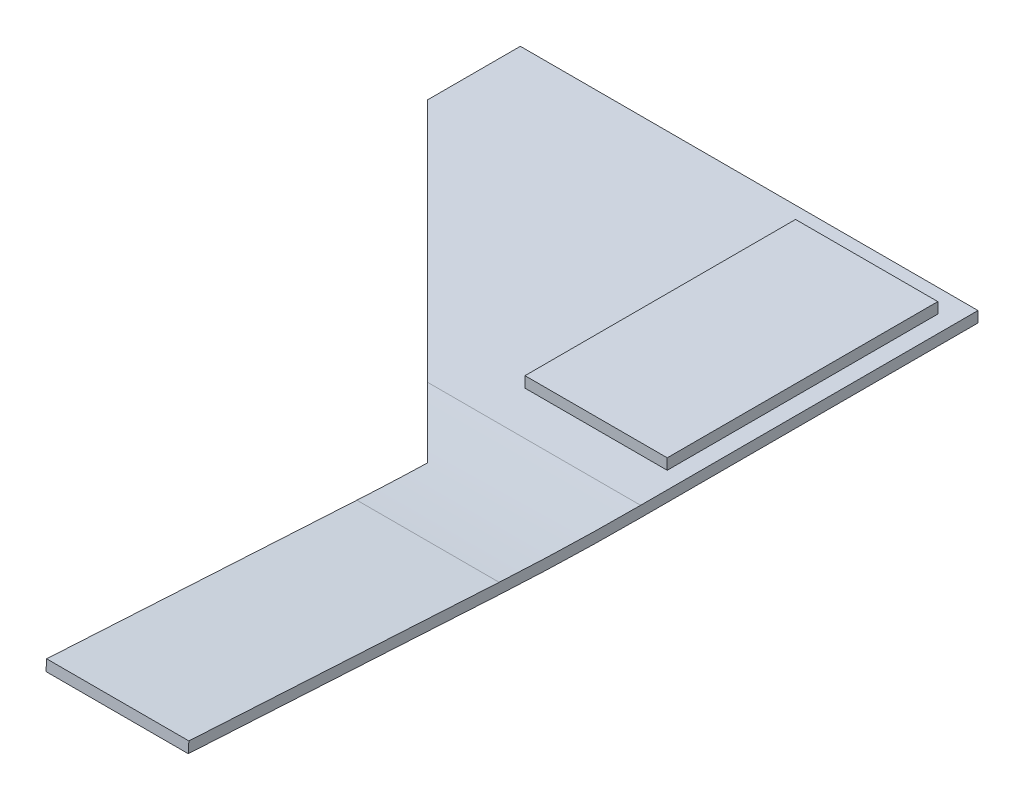
ISO-10303-21;
HEADER;
FILE_DESCRIPTION(('STEP AP214'),'2;1');
FILE_NAME('part.step','',(''),(''),'','','');
FILE_SCHEMA(('AUTOMOTIVE_DESIGN { 1 0 10303 214 1 1 1 1 }'));
ENDSEC;
DATA;
#1=APPLICATION_CONTEXT('core data for automotive mechanical design processes');
#2=APPLICATION_PROTOCOL_DEFINITION('international standard','automotive_design',2000,#1);
#3=PRODUCT_CONTEXT('',#1,'mechanical');
#4=PRODUCT('Part','Part','',(#3));
#5=PRODUCT_RELATED_PRODUCT_CATEGORY('part','',(#4));
#6=PRODUCT_DEFINITION_FORMATION('','',#4);
#7=PRODUCT_DEFINITION_CONTEXT('part definition',#1,'design');
#8=PRODUCT_DEFINITION('design','',#6,#7);
#9=PRODUCT_DEFINITION_SHAPE('','',#8);
#10=(LENGTH_UNIT() NAMED_UNIT(*) SI_UNIT(.MILLI.,.METRE.));
#11=(NAMED_UNIT(*) PLANE_ANGLE_UNIT() SI_UNIT($,.RADIAN.));
#12=(NAMED_UNIT(*) SI_UNIT($,.STERADIAN.) SOLID_ANGLE_UNIT());
#13=UNCERTAINTY_MEASURE_WITH_UNIT(LENGTH_MEASURE(1.E-05),#10,'distance_accuracy_value','');
#14=(GEOMETRIC_REPRESENTATION_CONTEXT(3) GLOBAL_UNCERTAINTY_ASSIGNED_CONTEXT((#13)) GLOBAL_UNIT_ASSIGNED_CONTEXT((#10,
#11,#12)) REPRESENTATION_CONTEXT('',''));
#15=CARTESIAN_POINT('',(0.,0.,0.));
#16=DIRECTION('',(0.,0.,1.));
#17=DIRECTION('',(1.,0.,0.));
#18=AXIS2_PLACEMENT_3D('',#15,#16,#17);
#19=CARTESIAN_POINT('',(-2.79400000000007,256.9464,37.3644658453137));
#20=DIRECTION('',(-1.,0.,0.));
#21=DIRECTION('',(0.,0.,1.));
#22=AXIS2_PLACEMENT_3D('',#19,#20,#21);
#23=CYLINDRICAL_SURFACE('',#22,203.2);
#24=CARTESIAN_POINT('',(-20.2935341546864,256.9464,37.3644658453137));
#25=DIRECTION('',(0.707106781186547,0.,-0.707106781186548));
#26=DIRECTION('',(-0.707106781186548,0.,-0.707106781186547));
#27=AXIS2_PLACEMENT_3D('',#24,#25,#26);
#28=ELLIPSE('',#27,287.368195874213,203.2);
#29=CARTESIAN_POINT('',(-20.2935341546864,53.7464,37.3644658453137));
#30=VERTEX_POINT('',#29);
#31=CARTESIAN_POINT('',(-14.478,53.8296366285449,43.18));
#32=VERTEX_POINT('',#31);
#33=EDGE_CURVE('E68',#30,#32,#28,.F.);
#34=ORIENTED_EDGE('',*,*,#33,.F.);
#35=DIRECTION('',(-1.,0.,0.));
#36=VECTOR('',#35,1.);
#37=CARTESIAN_POINT('',(-2.79400000000004,53.7464,37.3644658453137));
#38=LINE('',#37,#36);
#39=CARTESIAN_POINT('',(-2.79400000000004,53.7464,37.3644658453137));
#40=VERTEX_POINT('',#39);
#41=EDGE_CURVE('E49',#40,#30,#38,.T.);
#42=ORIENTED_EDGE('',*,*,#41,.F.);
#43=CARTESIAN_POINT('',(-2.79400000000007,256.9464,37.3644658453137));
#44=DIRECTION('',(-1.,0.,0.));
#45=DIRECTION('',(0.,0.,1.));
#46=AXIS2_PLACEMENT_3D('',#43,#44,#45);
#47=CIRCLE('',#46,203.2);
#48=CARTESIAN_POINT('',(-2.79400000000004,54.0790058876171,48.9860150557718));
#49=VERTEX_POINT('',#48);
#50=EDGE_CURVE('E234',#49,#40,#47,.F.);
#51=ORIENTED_EDGE('',*,*,#50,.F.);
#52=DIRECTION('',(-1.,0.,0.));
#53=VECTOR('',#52,1.);
#54=CARTESIAN_POINT('',(-2.79400000000003,54.0790058876171,48.9860150557718));
#55=LINE('',#54,#53);
#56=CARTESIAN_POINT('',(-14.478,54.0790058876171,48.9860150557718));
#57=VERTEX_POINT('',#56);
#58=EDGE_CURVE('E12',#49,#57,#55,.T.);
#59=ORIENTED_EDGE('',*,*,#58,.T.);
#60=CARTESIAN_POINT('',(-14.4780000000001,256.9464,37.3644658453137));
#61=DIRECTION('',(1.,0.,0.));
#62=DIRECTION('',(0.,1.,0.));
#63=AXIS2_PLACEMENT_3D('',#60,#61,#62);
#64=CIRCLE('',#63,203.2);
#65=EDGE_CURVE('E232',#32,#57,#64,.F.);
#66=ORIENTED_EDGE('',*,*,#65,.F.);
#67=EDGE_LOOP('',(#34,#42,#51,#59,#66));
#68=FACE_BOUND('',#67,.T.);
#69=ADVANCED_FACE('F45',(#68),#23,.T.);
#70=CARTESIAN_POINT('',(-2.79400000000003,55.5419318853809,74.5230565956833));
#71=DIRECTION('',(0.,0.998363160001885,-0.0571926634372937));
#72=DIRECTION('',(0.,0.0571926634372937,0.998363160001885));
#73=AXIS2_PLACEMENT_3D('',#70,#71,#72);
#74=PLANE('',#73);
#75=ORIENTED_EDGE('',*,*,#58,.F.);
#76=DIRECTION('',(0.,-0.0571926634372938,-0.998363160001885));
#77=VECTOR('',#76,1.);
#78=CARTESIAN_POINT('',(-2.79400000000003,55.5419318853809,74.5230565956833));
#79=LINE('',#78,#77);
#80=CARTESIAN_POINT('',(-2.79400000000003,55.5419318853809,74.5230565956833));
#81=VERTEX_POINT('',#80);
#82=EDGE_CURVE('E184',#81,#49,#79,.T.);
#83=ORIENTED_EDGE('',*,*,#82,.F.);
#84=DIRECTION('',(1.,0.,0.));
#85=VECTOR('',#84,1.);
#86=CARTESIAN_POINT('',(-14.478,55.5419318853809,74.5230565956833));
#87=LINE('',#86,#85);
#88=CARTESIAN_POINT('',(-14.478,55.5419318853809,74.5230565956833));
#89=VERTEX_POINT('',#88);
#90=EDGE_CURVE('E195',#89,#81,#87,.T.);
#91=ORIENTED_EDGE('',*,*,#90,.F.);
#92=DIRECTION('',(0.,-0.0571926634372938,-0.998363160001885));
#93=VECTOR('',#92,1.);
#94=CARTESIAN_POINT('',(-14.478,55.5419318853809,74.5230565956833));
#95=LINE('',#94,#93);
#96=EDGE_CURVE('E60',#89,#57,#95,.T.);
#97=ORIENTED_EDGE('',*,*,#96,.T.);
#98=EDGE_LOOP('',(#75,#83,#91,#97));
#99=FACE_BOUND('',#98,.T.);
#100=ADVANCED_FACE('F47',(#99),#74,.F.);
#101=CARTESIAN_POINT('',(0.,55.5244,0.));
#102=DIRECTION('',(0.,-1.,0.));
#103=DIRECTION('',(1.,0.,0.));
#104=AXIS2_PLACEMENT_3D('',#101,#102,#103);
#105=PLANE('',#104);
#106=DIRECTION('',(0.,0.,1.));
#107=VECTOR('',#106,1.);
#108=CARTESIAN_POINT('',(-15.875,55.5244,33.7820000000001));
#109=LINE('',#108,#107);
#110=CARTESIAN_POINT('',(-15.875,55.5244,11.5570000000001));
#111=VERTEX_POINT('',#110);
#112=CARTESIAN_POINT('',(-15.875,55.5244,33.7820000000001));
#113=VERTEX_POINT('',#112);
#114=EDGE_CURVE('E160',#111,#113,#109,.T.);
#115=ORIENTED_EDGE('',*,*,#114,.T.);
#116=DIRECTION('',(1.,0.,0.));
#117=VECTOR('',#116,1.);
#118=CARTESIAN_POINT('',(-15.875,55.5244,33.7820000000001));
#119=LINE('',#118,#117);
#120=CARTESIAN_POINT('',(-4.19100000000002,55.5244,33.7820000000001));
#121=VERTEX_POINT('',#120);
#122=EDGE_CURVE('E148',#113,#121,#119,.T.);
#123=ORIENTED_EDGE('',*,*,#122,.T.);
#124=DIRECTION('',(0.,0.,-1.));
#125=VECTOR('',#124,1.);
#126=CARTESIAN_POINT('',(-4.19100000000002,55.5244,33.7820000000001));
#127=LINE('',#126,#125);
#128=CARTESIAN_POINT('',(-4.19100000000002,55.5244,11.5570000000001));
#129=VERTEX_POINT('',#128);
#130=EDGE_CURVE('E159',#121,#129,#127,.T.);
#131=ORIENTED_EDGE('',*,*,#130,.T.);
#132=DIRECTION('',(-1.,0.,0.));
#133=VECTOR('',#132,1.);
#134=CARTESIAN_POINT('',(-15.875,55.5244,11.5570000000001));
#135=LINE('',#134,#133);
#136=EDGE_CURVE('E165',#129,#111,#135,.T.);
#137=ORIENTED_EDGE('',*,*,#136,.T.);
#138=EDGE_LOOP('',(#115,#123,#131,#137));
#139=FACE_BOUND('',#138,.T.);
#140=ADVANCED_FACE('F163',(#139),#105,.F.);
#141=CARTESIAN_POINT('',(-15.875,55.5244,33.7820000000001));
#142=DIRECTION('',(0.,0.,-1.));
#143=DIRECTION('',(-1.,0.,0.));
#144=AXIS2_PLACEMENT_3D('',#141,#142,#143);
#145=PLANE('',#144);
#146=DIRECTION('',(1.,0.,0.));
#147=VECTOR('',#146,1.);
#148=CARTESIAN_POINT('',(-15.875,54.6354,33.7820000000001));
#149=LINE('',#148,#147);
#150=CARTESIAN_POINT('',(-15.875,54.6354,33.7820000000001));
#151=VERTEX_POINT('',#150);
#152=CARTESIAN_POINT('',(-4.19100000000002,54.6354,33.7820000000001));
#153=VERTEX_POINT('',#152);
#154=EDGE_CURVE('E448',#151,#153,#149,.T.);
#155=ORIENTED_EDGE('',*,*,#154,.T.);
#156=DIRECTION('',(0.,-1.,0.));
#157=VECTOR('',#156,1.);
#158=CARTESIAN_POINT('',(-4.19100000000002,55.5244,33.7820000000001));
#159=LINE('',#158,#157);
#160=EDGE_CURVE('E156',#121,#153,#159,.T.);
#161=ORIENTED_EDGE('',*,*,#160,.F.);
#162=ORIENTED_EDGE('',*,*,#122,.F.);
#163=DIRECTION('',(0.,-1.,0.));
#164=VECTOR('',#163,1.);
#165=CARTESIAN_POINT('',(-15.875,55.5244,33.7820000000001));
#166=LINE('',#165,#164);
#167=EDGE_CURVE('E153',#113,#151,#166,.T.);
#168=ORIENTED_EDGE('',*,*,#167,.T.);
#169=EDGE_LOOP('',(#155,#161,#162,#168));
#170=FACE_BOUND('',#169,.T.);
#171=ADVANCED_FACE('F151',(#170),#145,.F.);
#172=CARTESIAN_POINT('',(-4.19100000000002,55.5244,33.7820000000001));
#173=DIRECTION('',(-1.,0.,0.));
#174=DIRECTION('',(0.,-1.,0.));
#175=AXIS2_PLACEMENT_3D('',#172,#173,#174);
#176=PLANE('',#175);
#177=DIRECTION('',(0.,0.,-1.));
#178=VECTOR('',#177,1.);
#179=CARTESIAN_POINT('',(-4.19100000000002,54.6354,33.7820000000001));
#180=LINE('',#179,#178);
#181=CARTESIAN_POINT('',(-4.19100000000002,54.6354,11.5570000000001));
#182=VERTEX_POINT('',#181);
#183=EDGE_CURVE('E442',#153,#182,#180,.T.);
#184=ORIENTED_EDGE('',*,*,#183,.T.);
#185=DIRECTION('',(0.,-1.,0.));
#186=VECTOR('',#185,1.);
#187=CARTESIAN_POINT('',(-4.19100000000002,55.5244,11.5570000000001));
#188=LINE('',#187,#186);
#189=EDGE_CURVE('E177',#129,#182,#188,.T.);
#190=ORIENTED_EDGE('',*,*,#189,.F.);
#191=ORIENTED_EDGE('',*,*,#130,.F.);
#192=ORIENTED_EDGE('',*,*,#160,.T.);
#193=EDGE_LOOP('',(#184,#190,#191,#192));
#194=FACE_BOUND('',#193,.T.);
#195=ADVANCED_FACE('F405',(#194),#176,.F.);
#196=CARTESIAN_POINT('',(-15.875,55.5244,11.5570000000001));
#197=DIRECTION('',(0.,0.,1.));
#198=DIRECTION('',(1.,0.,0.));
#199=AXIS2_PLACEMENT_3D('',#196,#197,#198);
#200=PLANE('',#199);
#201=DIRECTION('',(-1.,0.,0.));
#202=VECTOR('',#201,1.);
#203=CARTESIAN_POINT('',(-15.875,54.6354,11.5570000000001));
#204=LINE('',#203,#202);
#205=CARTESIAN_POINT('',(-15.875,54.6354,11.5570000000001));
#206=VERTEX_POINT('',#205);
#207=EDGE_CURVE('E169',#182,#206,#204,.T.);
#208=ORIENTED_EDGE('',*,*,#207,.T.);
#209=DIRECTION('',(0.,-1.,0.));
#210=VECTOR('',#209,1.);
#211=CARTESIAN_POINT('',(-15.875,55.5244,11.5570000000001));
#212=LINE('',#211,#210);
#213=EDGE_CURVE('E439',#111,#206,#212,.T.);
#214=ORIENTED_EDGE('',*,*,#213,.F.);
#215=ORIENTED_EDGE('',*,*,#136,.F.);
#216=ORIENTED_EDGE('',*,*,#189,.T.);
#217=EDGE_LOOP('',(#208,#214,#215,#216));
#218=FACE_BOUND('',#217,.T.);
#219=ADVANCED_FACE('F398',(#218),#200,.F.);
#220=CARTESIAN_POINT('',(-15.875,55.5244,33.7820000000001));
#221=DIRECTION('',(1.,0.,0.));
#222=DIRECTION('',(0.,1.,0.));
#223=AXIS2_PLACEMENT_3D('',#220,#221,#222);
#224=PLANE('',#223);
#225=DIRECTION('',(0.,0.,1.));
#226=VECTOR('',#225,1.);
#227=CARTESIAN_POINT('',(-15.875,54.6354,33.7820000000001));
#228=LINE('',#227,#226);
#229=EDGE_CURVE('E172',#206,#151,#228,.T.);
#230=ORIENTED_EDGE('',*,*,#229,.T.);
#231=ORIENTED_EDGE('',*,*,#167,.F.);
#232=ORIENTED_EDGE('',*,*,#114,.F.);
#233=ORIENTED_EDGE('',*,*,#213,.T.);
#234=EDGE_LOOP('',(#230,#231,#232,#233));
#235=FACE_BOUND('',#234,.T.);
#236=ADVANCED_FACE('F171',(#235),#224,.F.);
#237=CARTESIAN_POINT('',(-40.386,54.6354,17.2720000000001));
#238=DIRECTION('',(1.,0.,0.));
#239=DIRECTION('',(0.,0.,-1.));
#240=AXIS2_PLACEMENT_3D('',#237,#238,#239);
#241=PLANE('',#240);
#242=DIRECTION('',(0.,0.,1.));
#243=VECTOR('',#242,1.);
#244=CARTESIAN_POINT('',(-40.386,53.7464,17.2720000000001));
#245=LINE('',#244,#243);
#246=CARTESIAN_POINT('',(-40.386,53.7464,9.65200000000007));
#247=VERTEX_POINT('',#246);
#248=CARTESIAN_POINT('',(-40.386,53.7464,17.2720000000001));
#249=VERTEX_POINT('',#248);
#250=EDGE_CURVE('E205',#247,#249,#245,.T.);
#251=ORIENTED_EDGE('',*,*,#250,.T.);
#252=DIRECTION('',(0.,-1.,0.));
#253=VECTOR('',#252,1.);
#254=CARTESIAN_POINT('',(-40.386,54.6354,17.2720000000001));
#255=LINE('',#254,#253);
#256=CARTESIAN_POINT('',(-40.386,54.6354,17.2720000000001));
#257=VERTEX_POINT('',#256);
#258=EDGE_CURVE('E211',#257,#249,#255,.T.);
#259=ORIENTED_EDGE('',*,*,#258,.F.);
#260=DIRECTION('',(0.,0.,1.));
#261=VECTOR('',#260,1.);
#262=CARTESIAN_POINT('',(-40.386,54.6354,17.2720000000001));
#263=LINE('',#262,#261);
#264=CARTESIAN_POINT('',(-40.386,54.6354,9.65200000000007));
#265=VERTEX_POINT('',#264);
#266=EDGE_CURVE('E209',#265,#257,#263,.T.);
#267=ORIENTED_EDGE('',*,*,#266,.F.);
#268=DIRECTION('',(0.,-1.,0.));
#269=VECTOR('',#268,1.);
#270=CARTESIAN_POINT('',(-40.386,54.6354,9.65200000000007));
#271=LINE('',#270,#269);
#272=EDGE_CURVE('E222',#265,#247,#271,.T.);
#273=ORIENTED_EDGE('',*,*,#272,.T.);
#274=EDGE_LOOP('',(#251,#259,#267,#273));
#275=FACE_BOUND('',#274,.T.);
#276=ADVANCED_FACE('F288',(#275),#241,.F.);
#277=CARTESIAN_POINT('',(-14.478,56.4280239657132,74.4722955418351));
#278=DIRECTION('',(0.,0.0571926634372976,0.998363160001884));
#279=DIRECTION('',(0.,-0.998363160001884,0.0571926634372976));
#280=AXIS2_PLACEMENT_3D('',#277,#278,#279);
#281=PLANE('',#280);
#282=DIRECTION('',(0.,-0.998363160001884,0.0571926634372976));
#283=VECTOR('',#282,1.);
#284=CARTESIAN_POINT('',(-2.79400000000003,56.4280239657132,74.4722955418351));
#285=LINE('',#284,#283);
#286=CARTESIAN_POINT('',(-2.79400000000003,56.4280239657132,74.4722955418351));
#287=VERTEX_POINT('',#286);
#288=EDGE_CURVE('E175',#287,#81,#285,.T.);
#289=ORIENTED_EDGE('',*,*,#288,.F.);
#290=DIRECTION('',(1.,0.,0.));
#291=VECTOR('',#290,1.);
#292=CARTESIAN_POINT('',(-14.478,56.4280239657132,74.4722955418351));
#293=LINE('',#292,#291);
#294=CARTESIAN_POINT('',(-14.478,56.4280239657132,74.4722955418351));
#295=VERTEX_POINT('',#294);
#296=EDGE_CURVE('E187',#295,#287,#293,.T.);
#297=ORIENTED_EDGE('',*,*,#296,.F.);
#298=DIRECTION('',(0.,-0.998363160001884,0.0571926634372976));
#299=VECTOR('',#298,1.);
#300=CARTESIAN_POINT('',(-14.478,56.4280239657132,74.4722955418351));
#301=LINE('',#300,#299);
#302=EDGE_CURVE('E183',#295,#89,#301,.T.);
#303=ORIENTED_EDGE('',*,*,#302,.T.);
#304=ORIENTED_EDGE('',*,*,#90,.T.);
#305=EDGE_LOOP('',(#289,#297,#303,#304));
#306=FACE_BOUND('',#305,.T.);
#307=ADVANCED_FACE('F273',(#306),#281,.T.);
#308=CARTESIAN_POINT('',(-14.478,54.6354,43.18));
#309=DIRECTION('',(0.,0.998363160001884,-0.0571926634372938));
#310=DIRECTION('',(0.,0.0571926634372938,0.998363160001885));
#311=AXIS2_PLACEMENT_3D('',#308,#309,#310);
#312=PLANE('',#311);
#313=DIRECTION('',(0.,0.0571926634372938,0.998363160001885));
#314=VECTOR('',#313,1.);
#315=CARTESIAN_POINT('',(-2.79400000000004,54.6354,43.18));
#316=LINE('',#315,#314);
#317=CARTESIAN_POINT('',(-2.79400000000004,54.9680058876171,48.9860150557718));
#318=VERTEX_POINT('',#317);
#319=EDGE_CURVE('E173',#318,#287,#316,.T.);
#320=ORIENTED_EDGE('',*,*,#319,.F.);
#321=DIRECTION('',(1.,0.,0.));
#322=VECTOR('',#321,1.);
#323=CARTESIAN_POINT('',(-14.478,54.9680058876171,48.9860150557718));
#324=LINE('',#323,#322);
#325=CARTESIAN_POINT('',(-14.478,54.9680058876171,48.9860150557718));
#326=VERTEX_POINT('',#325);
#327=EDGE_CURVE('E241',#318,#326,#324,.F.);
#328=ORIENTED_EDGE('',*,*,#327,.T.);
#329=DIRECTION('',(0.,0.0571926634372938,0.998363160001885));
#330=VECTOR('',#329,1.);
#331=CARTESIAN_POINT('',(-14.478,54.6354,43.18));
#332=LINE('',#331,#330);
#333=EDGE_CURVE('E181',#326,#295,#332,.T.);
#334=ORIENTED_EDGE('',*,*,#333,.T.);
#335=ORIENTED_EDGE('',*,*,#296,.T.);
#336=EDGE_LOOP('',(#320,#328,#334,#335));
#337=FACE_BOUND('',#336,.T.);
#338=ADVANCED_FACE('F268',(#337),#312,.T.);
#339=CARTESIAN_POINT('',(-1.34894638775802E-13,257.8354,37.3644658453137));
#340=DIRECTION('',(1.,0.,0.));
#341=DIRECTION('',(0.,0.,-1.));
#342=AXIS2_PLACEMENT_3D('',#339,#340,#341);
#343=CYLINDRICAL_SURFACE('',#342,203.2);
#344=CARTESIAN_POINT('',(-14.4780000000001,257.8354,37.3644658453137));
#345=DIRECTION('',(1.,0.,0.));
#346=DIRECTION('',(0.,1.,0.));
#347=AXIS2_PLACEMENT_3D('',#344,#345,#346);
#348=CIRCLE('',#347,203.2);
#349=CARTESIAN_POINT('',(-14.478,54.7186366285449,43.18));
#350=VERTEX_POINT('',#349);
#351=EDGE_CURVE('E245',#326,#350,#348,.T.);
#352=ORIENTED_EDGE('',*,*,#351,.F.);
#353=ORIENTED_EDGE('',*,*,#327,.F.);
#354=CARTESIAN_POINT('',(-2.79400000000007,257.8354,37.3644658453137));
#355=DIRECTION('',(-1.,0.,0.));
#356=DIRECTION('',(0.,0.,1.));
#357=AXIS2_PLACEMENT_3D('',#354,#355,#356);
#358=CIRCLE('',#357,203.2);
#359=CARTESIAN_POINT('',(-2.79400000000004,54.6354,37.3644658453137));
#360=VERTEX_POINT('',#359);
#361=EDGE_CURVE('E243',#360,#318,#358,.T.);
#362=ORIENTED_EDGE('',*,*,#361,.F.);
#363=DIRECTION('',(1.,0.,0.));
#364=VECTOR('',#363,1.);
#365=CARTESIAN_POINT('',(0.,54.6354,37.3644658453137));
#366=LINE('',#365,#364);
#367=CARTESIAN_POINT('',(-20.2935341546864,54.6354,37.3644658453137));
#368=VERTEX_POINT('',#367);
#369=EDGE_CURVE('E238',#368,#360,#366,.T.);
#370=ORIENTED_EDGE('',*,*,#369,.F.);
#371=CARTESIAN_POINT('',(-20.2935341546865,257.8354,37.3644658453137));
#372=DIRECTION('',(0.707106781186547,0.,-0.707106781186548));
#373=DIRECTION('',(0.707106781186548,0.,0.707106781186547));
#374=AXIS2_PLACEMENT_3D('',#371,#372,#373);
#375=ELLIPSE('',#374,287.368195874213,203.2);
#376=EDGE_CURVE('E188',#350,#368,#375,.T.);
#377=ORIENTED_EDGE('',*,*,#376,.F.);
#378=EDGE_LOOP('',(#352,#353,#362,#370,#377));
#379=FACE_BOUND('',#378,.T.);
#380=ADVANCED_FACE('F261',(#379),#343,.F.);
#381=CARTESIAN_POINT('',(0.,54.6354,0.));
#382=DIRECTION('',(0.,-1.,0.));
#383=DIRECTION('',(1.,0.,0.));
#384=AXIS2_PLACEMENT_3D('',#381,#382,#383);
#385=PLANE('',#384);
#386=DIRECTION('',(0.707106781186548,0.,0.707106781186547));
#387=VECTOR('',#386,1.);
#388=CARTESIAN_POINT('',(-14.478,54.6354,43.18));
#389=LINE('',#388,#387);
#390=EDGE_CURVE('E201',#257,#368,#389,.T.);
#391=ORIENTED_EDGE('',*,*,#390,.T.);
#392=ORIENTED_EDGE('',*,*,#369,.T.);
#393=DIRECTION('',(0.,0.,-1.));
#394=VECTOR('',#393,1.);
#395=CARTESIAN_POINT('',(-2.79400000000004,54.6354,9.65200000000007));
#396=LINE('',#395,#394);
#397=CARTESIAN_POINT('',(-2.79400000000004,54.6354,9.65200000000007));
#398=VERTEX_POINT('',#397);
#399=EDGE_CURVE('E204',#360,#398,#396,.T.);
#400=ORIENTED_EDGE('',*,*,#399,.T.);
#401=DIRECTION('',(-1.,0.,0.));
#402=VECTOR('',#401,1.);
#403=CARTESIAN_POINT('',(-40.386,54.6354,9.65200000000007));
#404=LINE('',#403,#402);
#405=EDGE_CURVE('E207',#398,#265,#404,.T.);
#406=ORIENTED_EDGE('',*,*,#405,.T.);
#407=ORIENTED_EDGE('',*,*,#266,.T.);
#408=EDGE_LOOP('',(#391,#392,#400,#406,#407));
#409=FACE_BOUND('',#408,.T.);
#410=ORIENTED_EDGE('',*,*,#229,.F.);
#411=ORIENTED_EDGE('',*,*,#207,.F.);
#412=ORIENTED_EDGE('',*,*,#183,.F.);
#413=ORIENTED_EDGE('',*,*,#154,.F.);
#414=EDGE_LOOP('',(#410,#411,#412,#413));
#415=FACE_BOUND('',#414,.T.);
#416=ADVANCED_FACE('F256',(#409,#415),#385,.F.);
#417=CARTESIAN_POINT('',(-40.386,54.6354,9.65200000000007));
#418=DIRECTION('',(0.,0.,1.));
#419=DIRECTION('',(1.,0.,0.));
#420=AXIS2_PLACEMENT_3D('',#417,#418,#419);
#421=PLANE('',#420);
#422=DIRECTION('',(-1.,0.,0.));
#423=VECTOR('',#422,1.);
#424=CARTESIAN_POINT('',(-40.386,53.7464,9.65200000000007));
#425=LINE('',#424,#423);
#426=CARTESIAN_POINT('',(-2.79400000000004,53.7464,9.65200000000007));
#427=VERTEX_POINT('',#426);
#428=EDGE_CURVE('E216',#427,#247,#425,.T.);
#429=ORIENTED_EDGE('',*,*,#428,.T.);
#430=ORIENTED_EDGE('',*,*,#272,.F.);
#431=ORIENTED_EDGE('',*,*,#405,.F.);
#432=DIRECTION('',(0.,-1.,0.));
#433=VECTOR('',#432,1.);
#434=CARTESIAN_POINT('',(-2.79400000000004,54.6354,9.65200000000007));
#435=LINE('',#434,#433);
#436=EDGE_CURVE('E225',#398,#427,#435,.T.);
#437=ORIENTED_EDGE('',*,*,#436,.T.);
#438=EDGE_LOOP('',(#429,#430,#431,#437));
#439=FACE_BOUND('',#438,.T.);
#440=ADVANCED_FACE('F285',(#439),#421,.F.);
#441=CARTESIAN_POINT('',(0.,53.7464,0.));
#442=DIRECTION('',(0.,-1.,0.));
#443=DIRECTION('',(1.,0.,0.));
#444=AXIS2_PLACEMENT_3D('',#441,#442,#443);
#445=PLANE('',#444);
#446=DIRECTION('',(0.,0.,-1.));
#447=VECTOR('',#446,1.);
#448=CARTESIAN_POINT('',(-2.79400000000004,53.7464,9.65200000000007));
#449=LINE('',#448,#447);
#450=EDGE_CURVE('E213',#40,#427,#449,.T.);
#451=ORIENTED_EDGE('',*,*,#450,.F.);
#452=ORIENTED_EDGE('',*,*,#41,.T.);
#453=DIRECTION('',(0.707106781186548,0.,0.707106781186547));
#454=VECTOR('',#453,1.);
#455=CARTESIAN_POINT('',(-14.478,53.7464,43.18));
#456=LINE('',#455,#454);
#457=EDGE_CURVE('E198',#249,#30,#456,.T.);
#458=ORIENTED_EDGE('',*,*,#457,.F.);
#459=ORIENTED_EDGE('',*,*,#250,.F.);
#460=ORIENTED_EDGE('',*,*,#428,.F.);
#461=EDGE_LOOP('',(#451,#452,#458,#459,#460));
#462=FACE_BOUND('',#461,.T.);
#463=ADVANCED_FACE('F280',(#462),#445,.T.);
#464=CARTESIAN_POINT('',(-2.79400000000004,54.6354,9.65200000000007));
#465=DIRECTION('',(-1.,0.,0.));
#466=DIRECTION('',(0.,0.,1.));
#467=AXIS2_PLACEMENT_3D('',#464,#465,#466);
#468=PLANE('',#467);
#469=ORIENTED_EDGE('',*,*,#82,.T.);
#470=ORIENTED_EDGE('',*,*,#50,.T.);
#471=ORIENTED_EDGE('',*,*,#450,.T.);
#472=ORIENTED_EDGE('',*,*,#436,.F.);
#473=ORIENTED_EDGE('',*,*,#399,.F.);
#474=ORIENTED_EDGE('',*,*,#361,.T.);
#475=ORIENTED_EDGE('',*,*,#319,.T.);
#476=ORIENTED_EDGE('',*,*,#288,.T.);
#477=EDGE_LOOP('',(#469,#470,#471,#472,#473,#474,#475,#476));
#478=FACE_BOUND('',#477,.T.);
#479=ADVANCED_FACE('F265',(#478),#468,.F.);
#480=CARTESIAN_POINT('',(-14.478,0.,0.));
#481=DIRECTION('',(1.,0.,0.));
#482=DIRECTION('',(0.,1.,0.));
#483=AXIS2_PLACEMENT_3D('',#480,#481,#482);
#484=PLANE('',#483);
#485=DIRECTION('',(0.,-1.,0.));
#486=VECTOR('',#485,1.);
#487=CARTESIAN_POINT('',(-14.478,54.6354,43.18));
#488=LINE('',#487,#486);
#489=EDGE_CURVE('E228',#350,#32,#488,.T.);
#490=ORIENTED_EDGE('',*,*,#489,.T.);
#491=ORIENTED_EDGE('',*,*,#65,.T.);
#492=ORIENTED_EDGE('',*,*,#96,.F.);
#493=ORIENTED_EDGE('',*,*,#302,.F.);
#494=ORIENTED_EDGE('',*,*,#333,.F.);
#495=ORIENTED_EDGE('',*,*,#351,.T.);
#496=EDGE_LOOP('',(#490,#491,#492,#493,#494,#495));
#497=FACE_BOUND('',#496,.T.);
#498=ADVANCED_FACE('F289',(#497),#484,.F.);
#499=CARTESIAN_POINT('',(-14.478,54.6354,43.18));
#500=DIRECTION('',(0.707106781186547,0.,-0.707106781186548));
#501=DIRECTION('',(-0.707106781186548,0.,-0.707106781186547));
#502=AXIS2_PLACEMENT_3D('',#499,#500,#501);
#503=PLANE('',#502);
#504=ORIENTED_EDGE('',*,*,#457,.T.);
#505=ORIENTED_EDGE('',*,*,#33,.T.);
#506=ORIENTED_EDGE('',*,*,#489,.F.);
#507=ORIENTED_EDGE('',*,*,#376,.T.);
#508=ORIENTED_EDGE('',*,*,#390,.F.);
#509=ORIENTED_EDGE('',*,*,#258,.T.);
#510=EDGE_LOOP('',(#504,#505,#506,#507,#508,#509));
#511=FACE_BOUND('',#510,.T.);
#512=ADVANCED_FACE('F251',(#511),#503,.F.);
#513=CLOSED_SHELL('',(#69,#100,#140,#171,#195,#219,#236,#276,#307,#338,#380,#416,#440,#463,#479,
#498,#512));
#514=MANIFOLD_SOLID_BREP('B2',#513);
#515=ADVANCED_BREP_SHAPE_REPRESENTATION('',(#18,#514),#14);
#516=SHAPE_DEFINITION_REPRESENTATION(#9,#515);
ENDSEC;
END-ISO-10303-21;
